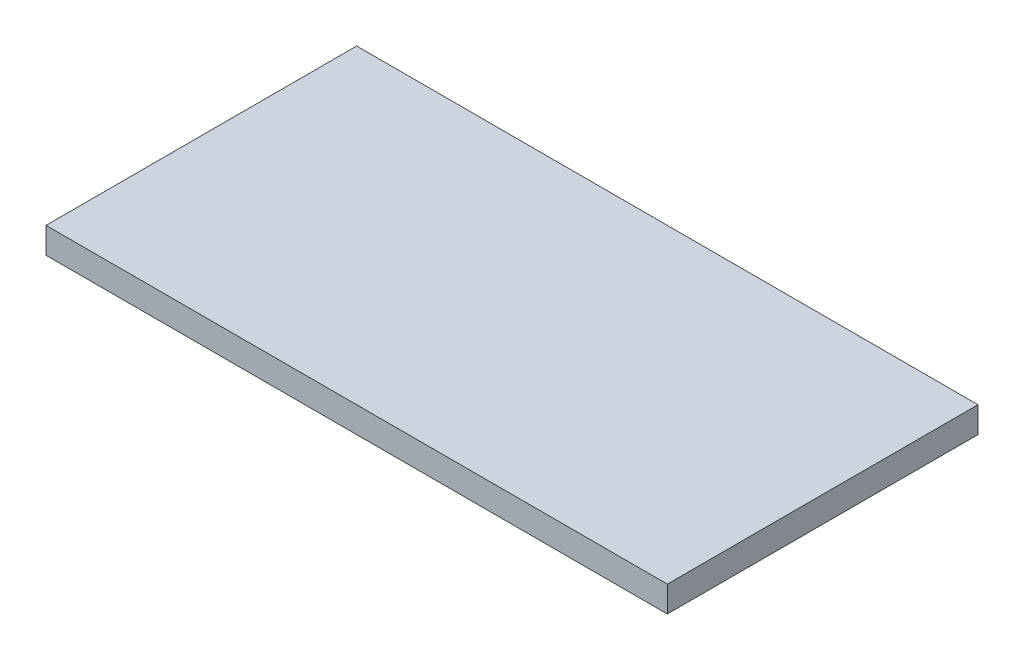
ISO-10303-21;
HEADER;
FILE_DESCRIPTION(('STEP AP214'),'2;1');
FILE_NAME('part.step','',(''),(''),'','','');
FILE_SCHEMA(('AUTOMOTIVE_DESIGN { 1 0 10303 214 1 1 1 1 }'));
ENDSEC;
DATA;
#1=APPLICATION_CONTEXT('core data for automotive mechanical design processes');
#2=APPLICATION_PROTOCOL_DEFINITION('international standard','automotive_design',2000,#1);
#3=PRODUCT_CONTEXT('',#1,'mechanical');
#4=PRODUCT('Part','Part','',(#3));
#5=PRODUCT_RELATED_PRODUCT_CATEGORY('part','',(#4));
#6=PRODUCT_DEFINITION_FORMATION('','',#4);
#7=PRODUCT_DEFINITION_CONTEXT('part definition',#1,'design');
#8=PRODUCT_DEFINITION('design','',#6,#7);
#9=PRODUCT_DEFINITION_SHAPE('','',#8);
#10=(LENGTH_UNIT() NAMED_UNIT(*) SI_UNIT(.MILLI.,.METRE.));
#11=(NAMED_UNIT(*) PLANE_ANGLE_UNIT() SI_UNIT($,.RADIAN.));
#12=(NAMED_UNIT(*) SI_UNIT($,.STERADIAN.) SOLID_ANGLE_UNIT());
#13=UNCERTAINTY_MEASURE_WITH_UNIT(LENGTH_MEASURE(1.E-05),#10,'distance_accuracy_value','');
#14=(GEOMETRIC_REPRESENTATION_CONTEXT(3) GLOBAL_UNCERTAINTY_ASSIGNED_CONTEXT((#13)) GLOBAL_UNIT_ASSIGNED_CONTEXT((#10,
#11,#12)) REPRESENTATION_CONTEXT('',''));
#15=CARTESIAN_POINT('',(0.,0.,0.));
#16=DIRECTION('',(0.,0.,1.));
#17=DIRECTION('',(1.,0.,0.));
#18=AXIS2_PLACEMENT_3D('',#15,#16,#17);
#19=CARTESIAN_POINT('',(60.,5.,-30.));
#20=DIRECTION('',(-1.,0.,0.));
#21=DIRECTION('',(0.,0.,1.));
#22=AXIS2_PLACEMENT_3D('',#19,#20,#21);
#23=PLANE('',#22);
#24=DIRECTION('',(0.,0.,-1.));
#25=VECTOR('',#24,1.);
#26=CARTESIAN_POINT('',(60.,0.,-30.));
#27=LINE('',#26,#25);
#28=CARTESIAN_POINT('',(60.,0.,30.));
#29=VERTEX_POINT('',#28);
#30=CARTESIAN_POINT('',(60.,0.,-30.));
#31=VERTEX_POINT('',#30);
#32=EDGE_CURVE('E107',#29,#31,#27,.T.);
#33=ORIENTED_EDGE('',*,*,#32,.T.);
#34=DIRECTION('',(0.,-1.,0.));
#35=VECTOR('',#34,1.);
#36=CARTESIAN_POINT('',(60.,5.,-30.));
#37=LINE('',#36,#35);
#38=CARTESIAN_POINT('',(60.,5.,-30.));
#39=VERTEX_POINT('',#38);
#40=EDGE_CURVE('E11',#39,#31,#37,.T.);
#41=ORIENTED_EDGE('',*,*,#40,.F.);
#42=DIRECTION('',(0.,0.,-1.));
#43=VECTOR('',#42,1.);
#44=CARTESIAN_POINT('',(60.,5.,-30.));
#45=LINE('',#44,#43);
#46=CARTESIAN_POINT('',(60.,5.,30.));
#47=VERTEX_POINT('',#46);
#48=EDGE_CURVE('E91',#47,#39,#45,.T.);
#49=ORIENTED_EDGE('',*,*,#48,.F.);
#50=DIRECTION('',(0.,-1.,0.));
#51=VECTOR('',#50,1.);
#52=CARTESIAN_POINT('',(60.,5.,30.));
#53=LINE('',#52,#51);
#54=EDGE_CURVE('E103',#47,#29,#53,.T.);
#55=ORIENTED_EDGE('',*,*,#54,.T.);
#56=EDGE_LOOP('',(#33,#41,#49,#55));
#57=FACE_BOUND('',#56,.T.);
#58=ADVANCED_FACE('F39',(#57),#23,.F.);
#59=CARTESIAN_POINT('',(-60.,5.,-30.));
#60=DIRECTION('',(0.,0.,1.));
#61=DIRECTION('',(1.,0.,0.));
#62=AXIS2_PLACEMENT_3D('',#59,#60,#61);
#63=PLANE('',#62);
#64=DIRECTION('',(-1.,0.,0.));
#65=VECTOR('',#64,1.);
#66=CARTESIAN_POINT('',(-60.,0.,-30.));
#67=LINE('',#66,#65);
#68=CARTESIAN_POINT('',(-60.,0.,-30.));
#69=VERTEX_POINT('',#68);
#70=EDGE_CURVE('E96',#31,#69,#67,.T.);
#71=ORIENTED_EDGE('',*,*,#70,.T.);
#72=DIRECTION('',(0.,-1.,0.));
#73=VECTOR('',#72,1.);
#74=CARTESIAN_POINT('',(-60.,5.,-30.));
#75=LINE('',#74,#73);
#76=CARTESIAN_POINT('',(-60.,5.,-30.));
#77=VERTEX_POINT('',#76);
#78=EDGE_CURVE('E48',#77,#69,#75,.T.);
#79=ORIENTED_EDGE('',*,*,#78,.F.);
#80=DIRECTION('',(-1.,0.,0.));
#81=VECTOR('',#80,1.);
#82=CARTESIAN_POINT('',(-60.,5.,-30.));
#83=LINE('',#82,#81);
#84=EDGE_CURVE('E86',#39,#77,#83,.T.);
#85=ORIENTED_EDGE('',*,*,#84,.F.);
#86=ORIENTED_EDGE('',*,*,#40,.T.);
#87=EDGE_LOOP('',(#71,#79,#85,#86));
#88=FACE_BOUND('',#87,.T.);
#89=ADVANCED_FACE('F95',(#88),#63,.F.);
#90=CARTESIAN_POINT('',(-60.,5.,-30.));
#91=DIRECTION('',(1.,0.,0.));
#92=DIRECTION('',(0.,0.,-1.));
#93=AXIS2_PLACEMENT_3D('',#90,#91,#92);
#94=PLANE('',#93);
#95=DIRECTION('',(0.,0.,1.));
#96=VECTOR('',#95,1.);
#97=CARTESIAN_POINT('',(-60.,0.,-30.));
#98=LINE('',#97,#96);
#99=CARTESIAN_POINT('',(-60.,0.,30.));
#100=VERTEX_POINT('',#99);
#101=EDGE_CURVE('E73',#69,#100,#98,.T.);
#102=ORIENTED_EDGE('',*,*,#101,.T.);
#103=DIRECTION('',(0.,-1.,0.));
#104=VECTOR('',#103,1.);
#105=CARTESIAN_POINT('',(-60.,5.,30.));
#106=LINE('',#105,#104);
#107=CARTESIAN_POINT('',(-60.,5.,30.));
#108=VERTEX_POINT('',#107);
#109=EDGE_CURVE('E98',#108,#100,#106,.T.);
#110=ORIENTED_EDGE('',*,*,#109,.F.);
#111=DIRECTION('',(0.,0.,1.));
#112=VECTOR('',#111,1.);
#113=CARTESIAN_POINT('',(-60.,5.,-30.));
#114=LINE('',#113,#112);
#115=EDGE_CURVE('E89',#77,#108,#114,.T.);
#116=ORIENTED_EDGE('',*,*,#115,.F.);
#117=ORIENTED_EDGE('',*,*,#78,.T.);
#118=EDGE_LOOP('',(#102,#110,#116,#117));
#119=FACE_BOUND('',#118,.T.);
#120=ADVANCED_FACE('F99',(#119),#94,.F.);
#121=CARTESIAN_POINT('',(-60.,5.,30.));
#122=DIRECTION('',(0.,0.,-1.));
#123=DIRECTION('',(-1.,0.,0.));
#124=AXIS2_PLACEMENT_3D('',#121,#122,#123);
#125=PLANE('',#124);
#126=DIRECTION('',(1.,0.,0.));
#127=VECTOR('',#126,1.);
#128=CARTESIAN_POINT('',(-60.,0.,30.));
#129=LINE('',#128,#127);
#130=EDGE_CURVE('E79',#100,#29,#129,.T.);
#131=ORIENTED_EDGE('',*,*,#130,.T.);
#132=ORIENTED_EDGE('',*,*,#54,.F.);
#133=DIRECTION('',(1.,0.,0.));
#134=VECTOR('',#133,1.);
#135=CARTESIAN_POINT('',(-60.,5.,30.));
#136=LINE('',#135,#134);
#137=EDGE_CURVE('E56',#108,#47,#136,.T.);
#138=ORIENTED_EDGE('',*,*,#137,.F.);
#139=ORIENTED_EDGE('',*,*,#109,.T.);
#140=EDGE_LOOP('',(#131,#132,#138,#139));
#141=FACE_BOUND('',#140,.T.);
#142=ADVANCED_FACE('F120',(#141),#125,.F.);
#143=CARTESIAN_POINT('',(0.,5.,0.));
#144=DIRECTION('',(0.,1.,0.));
#145=DIRECTION('',(0.,0.,1.));
#146=AXIS2_PLACEMENT_3D('',#143,#144,#145);
#147=PLANE('',#146);
#148=ORIENTED_EDGE('',*,*,#48,.T.);
#149=ORIENTED_EDGE('',*,*,#84,.T.);
#150=ORIENTED_EDGE('',*,*,#115,.T.);
#151=ORIENTED_EDGE('',*,*,#137,.T.);
#152=EDGE_LOOP('',(#148,#149,#150,#151));
#153=FACE_BOUND('',#152,.T.);
#154=ADVANCED_FACE('F87',(#153),#147,.T.);
#155=CARTESIAN_POINT('',(0.,0.,0.));
#156=DIRECTION('',(0.,1.,0.));
#157=DIRECTION('',(0.,0.,1.));
#158=AXIS2_PLACEMENT_3D('',#155,#156,#157);
#159=PLANE('',#158);
#160=ORIENTED_EDGE('',*,*,#32,.F.);
#161=ORIENTED_EDGE('',*,*,#130,.F.);
#162=ORIENTED_EDGE('',*,*,#101,.F.);
#163=ORIENTED_EDGE('',*,*,#70,.F.);
#164=EDGE_LOOP('',(#160,#161,#162,#163));
#165=FACE_BOUND('',#164,.T.);
#166=ADVANCED_FACE('F123',(#165),#159,.F.);
#167=CLOSED_SHELL('',(#58,#89,#120,#142,#154,#166));
#168=MANIFOLD_SOLID_BREP('B2',#167);
#169=ADVANCED_BREP_SHAPE_REPRESENTATION('',(#18,#168),#14);
#170=SHAPE_DEFINITION_REPRESENTATION(#9,#169);
ENDSEC;
END-ISO-10303-21;
